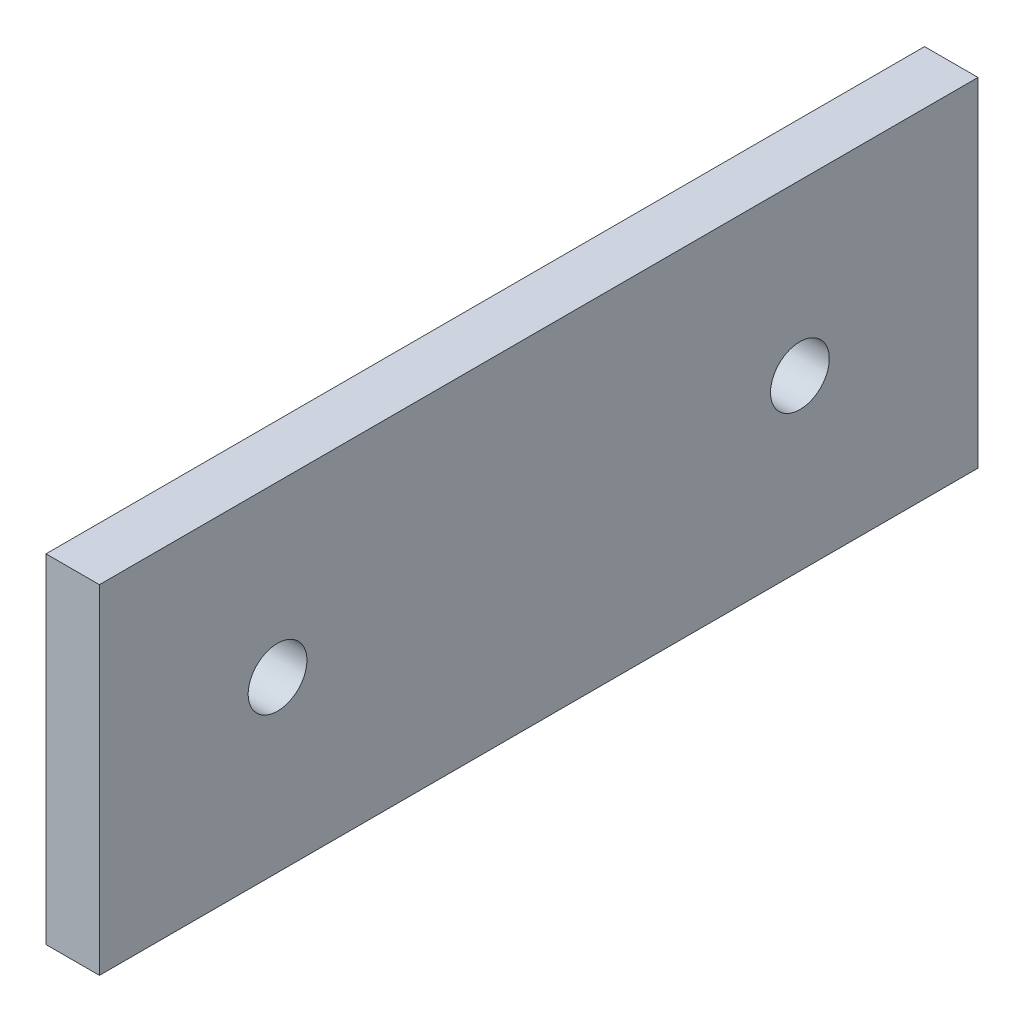
ISO-10303-21;
HEADER;
FILE_DESCRIPTION(('STEP AP214'),'2;1');
FILE_NAME('part.step','',(''),(''),'','','');
FILE_SCHEMA(('AUTOMOTIVE_DESIGN { 1 0 10303 214 1 1 1 1 }'));
ENDSEC;
DATA;
#1=APPLICATION_CONTEXT('core data for automotive mechanical design processes');
#2=APPLICATION_PROTOCOL_DEFINITION('international standard','automotive_design',2000,#1);
#3=PRODUCT_CONTEXT('',#1,'mechanical');
#4=PRODUCT('Part','Part','',(#3));
#5=PRODUCT_RELATED_PRODUCT_CATEGORY('part','',(#4));
#6=PRODUCT_DEFINITION_FORMATION('','',#4);
#7=PRODUCT_DEFINITION_CONTEXT('part definition',#1,'design');
#8=PRODUCT_DEFINITION('design','',#6,#7);
#9=PRODUCT_DEFINITION_SHAPE('','',#8);
#10=(LENGTH_UNIT() NAMED_UNIT(*) SI_UNIT(.MILLI.,.METRE.));
#11=(NAMED_UNIT(*) PLANE_ANGLE_UNIT() SI_UNIT($,.RADIAN.));
#12=(NAMED_UNIT(*) SI_UNIT($,.STERADIAN.) SOLID_ANGLE_UNIT());
#13=UNCERTAINTY_MEASURE_WITH_UNIT(LENGTH_MEASURE(1.E-05),#10,'distance_accuracy_value','');
#14=(GEOMETRIC_REPRESENTATION_CONTEXT(3) GLOBAL_UNCERTAINTY_ASSIGNED_CONTEXT((#13)) GLOBAL_UNIT_ASSIGNED_CONTEXT((#10,
#11,#12)) REPRESENTATION_CONTEXT('',''));
#15=CARTESIAN_POINT('',(0.,0.,0.));
#16=DIRECTION('',(0.,0.,1.));
#17=DIRECTION('',(1.,0.,0.));
#18=AXIS2_PLACEMENT_3D('',#15,#16,#17);
#19=CARTESIAN_POINT('',(0.,0.,49.33));
#20=DIRECTION('',(0.,0.,1.));
#21=DIRECTION('',(1.,0.,0.));
#22=AXIS2_PLACEMENT_3D('',#19,#20,#21);
#23=PLANE('',#22);
#24=DIRECTION('',(1.,0.,0.));
#25=VECTOR('',#24,1.);
#26=CARTESIAN_POINT('',(0.,-3.,49.33));
#27=LINE('',#26,#25);
#28=CARTESIAN_POINT('',(-3.,-3.,49.33));
#29=VERTEX_POINT('',#28);
#30=CARTESIAN_POINT('',(0.,-3.,49.33));
#31=VERTEX_POINT('',#30);
#32=EDGE_CURVE('E114',#29,#31,#27,.T.);
#33=ORIENTED_EDGE('',*,*,#32,.T.);
#34=DIRECTION('',(0.,-1.,0.));
#35=VECTOR('',#34,1.);
#36=CARTESIAN_POINT('',(0.,0.,49.33));
#37=LINE('',#36,#35);
#38=CARTESIAN_POINT('',(0.,16.,49.33));
#39=VERTEX_POINT('',#38);
#40=EDGE_CURVE('E94',#39,#31,#37,.T.);
#41=ORIENTED_EDGE('',*,*,#40,.F.);
#42=DIRECTION('',(-1.,0.,0.));
#43=VECTOR('',#42,1.);
#44=CARTESIAN_POINT('',(0.,16.,49.33));
#45=LINE('',#44,#43);
#46=CARTESIAN_POINT('',(-3.,16.,49.33));
#47=VERTEX_POINT('',#46);
#48=EDGE_CURVE('E77',#39,#47,#45,.T.);
#49=ORIENTED_EDGE('',*,*,#48,.T.);
#50=DIRECTION('',(0.,-1.,0.));
#51=VECTOR('',#50,1.);
#52=CARTESIAN_POINT('',(-3.,0.,49.33));
#53=LINE('',#52,#51);
#54=EDGE_CURVE('E117',#47,#29,#53,.T.);
#55=ORIENTED_EDGE('',*,*,#54,.T.);
#56=EDGE_LOOP('',(#33,#41,#49,#55));
#57=FACE_BOUND('',#56,.T.);
#58=ADVANCED_FACE('F60',(#57),#23,.T.);
#59=CARTESIAN_POINT('',(0.,0.,0.));
#60=DIRECTION('',(0.,0.,1.));
#61=DIRECTION('',(1.,0.,0.));
#62=AXIS2_PLACEMENT_3D('',#59,#60,#61);
#63=PLANE('',#62);
#64=DIRECTION('',(0.,-1.,0.));
#65=VECTOR('',#64,1.);
#66=CARTESIAN_POINT('',(0.,0.,0.));
#67=LINE('',#66,#65);
#68=CARTESIAN_POINT('',(0.,16.,0.));
#69=VERTEX_POINT('',#68);
#70=CARTESIAN_POINT('',(0.,-3.,0.));
#71=VERTEX_POINT('',#70);
#72=EDGE_CURVE('E110',#69,#71,#67,.T.);
#73=ORIENTED_EDGE('',*,*,#72,.T.);
#74=DIRECTION('',(1.,0.,0.));
#75=VECTOR('',#74,1.);
#76=CARTESIAN_POINT('',(0.,-3.,0.));
#77=LINE('',#76,#75);
#78=CARTESIAN_POINT('',(-3.,-3.,0.));
#79=VERTEX_POINT('',#78);
#80=EDGE_CURVE('E89',#79,#71,#77,.T.);
#81=ORIENTED_EDGE('',*,*,#80,.F.);
#82=DIRECTION('',(0.,-1.,0.));
#83=VECTOR('',#82,1.);
#84=CARTESIAN_POINT('',(-3.,0.,0.));
#85=LINE('',#84,#83);
#86=CARTESIAN_POINT('',(-3.,16.,0.));
#87=VERTEX_POINT('',#86);
#88=EDGE_CURVE('E109',#87,#79,#85,.T.);
#89=ORIENTED_EDGE('',*,*,#88,.F.);
#90=DIRECTION('',(-1.,0.,0.));
#91=VECTOR('',#90,1.);
#92=CARTESIAN_POINT('',(0.,16.,0.));
#93=LINE('',#92,#91);
#94=EDGE_CURVE('E121',#69,#87,#93,.T.);
#95=ORIENTED_EDGE('',*,*,#94,.F.);
#96=EDGE_LOOP('',(#73,#81,#89,#95));
#97=FACE_BOUND('',#96,.T.);
#98=ADVANCED_FACE('F132',(#97),#63,.F.);
#99=CARTESIAN_POINT('',(0.,-3.,49.33));
#100=DIRECTION('',(0.,1.,0.));
#101=DIRECTION('',(0.,0.,1.));
#102=AXIS2_PLACEMENT_3D('',#99,#100,#101);
#103=PLANE('',#102);
#104=DIRECTION('',(0.,0.,-1.));
#105=VECTOR('',#104,1.);
#106=CARTESIAN_POINT('',(0.,-3.,49.33));
#107=LINE('',#106,#105);
#108=EDGE_CURVE('E106',#31,#71,#107,.T.);
#109=ORIENTED_EDGE('',*,*,#108,.F.);
#110=ORIENTED_EDGE('',*,*,#32,.F.);
#111=DIRECTION('',(0.,0.,-1.));
#112=VECTOR('',#111,1.);
#113=CARTESIAN_POINT('',(-3.,-3.,49.33));
#114=LINE('',#113,#112);
#115=EDGE_CURVE('E12',#29,#79,#114,.T.);
#116=ORIENTED_EDGE('',*,*,#115,.T.);
#117=ORIENTED_EDGE('',*,*,#80,.T.);
#118=EDGE_LOOP('',(#109,#110,#116,#117));
#119=FACE_BOUND('',#118,.T.);
#120=ADVANCED_FACE('F113',(#119),#103,.F.);
#121=CARTESIAN_POINT('',(0.,16.,49.33));
#122=DIRECTION('',(0.,-1.,0.));
#123=DIRECTION('',(0.,0.,-1.));
#124=AXIS2_PLACEMENT_3D('',#121,#122,#123);
#125=PLANE('',#124);
#126=DIRECTION('',(0.,0.,1.));
#127=VECTOR('',#126,1.);
#128=CARTESIAN_POINT('',(0.,16.,49.33));
#129=LINE('',#128,#127);
#130=EDGE_CURVE('E108',#69,#39,#129,.T.);
#131=ORIENTED_EDGE('',*,*,#130,.F.);
#132=ORIENTED_EDGE('',*,*,#94,.T.);
#133=DIRECTION('',(0.,0.,-1.));
#134=VECTOR('',#133,1.);
#135=CARTESIAN_POINT('',(-3.,16.,49.33));
#136=LINE('',#135,#134);
#137=EDGE_CURVE('E69',#47,#87,#136,.T.);
#138=ORIENTED_EDGE('',*,*,#137,.F.);
#139=ORIENTED_EDGE('',*,*,#48,.F.);
#140=EDGE_LOOP('',(#131,#132,#138,#139));
#141=FACE_BOUND('',#140,.T.);
#142=ADVANCED_FACE('F133',(#141),#125,.F.);
#143=CARTESIAN_POINT('',(-3.,0.,49.33));
#144=DIRECTION('',(1.,0.,0.));
#145=DIRECTION('',(0.,0.,-1.));
#146=AXIS2_PLACEMENT_3D('',#143,#144,#145);
#147=PLANE('',#146);
#148=CARTESIAN_POINT('',(-3.,6.5,10.));
#149=DIRECTION('',(-1.,0.,0.));
#150=DIRECTION('',(0.,0.,1.));
#151=AXIS2_PLACEMENT_3D('',#148,#149,#150);
#152=CIRCLE('',#151,1.65);
#153=CARTESIAN_POINT('',(-3.,6.5,11.65));
#154=VERTEX_POINT('',#153);
#155=EDGE_CURVE('E137',#154,#154,#152,.T.);
#156=ORIENTED_EDGE('',*,*,#155,.F.);
#157=EDGE_LOOP('',(#156));
#158=FACE_BOUND('',#157,.T.);
#159=CARTESIAN_POINT('',(-3.,6.5,39.33));
#160=DIRECTION('',(-1.,0.,0.));
#161=DIRECTION('',(0.,0.,1.));
#162=AXIS2_PLACEMENT_3D('',#159,#160,#161);
#163=CIRCLE('',#162,1.65);
#164=CARTESIAN_POINT('',(-3.,6.5,40.98));
#165=VERTEX_POINT('',#164);
#166=EDGE_CURVE('E134',#165,#165,#163,.T.);
#167=ORIENTED_EDGE('',*,*,#166,.F.);
#168=EDGE_LOOP('',(#167));
#169=FACE_BOUND('',#168,.T.);
#170=ORIENTED_EDGE('',*,*,#88,.T.);
#171=ORIENTED_EDGE('',*,*,#115,.F.);
#172=ORIENTED_EDGE('',*,*,#54,.F.);
#173=ORIENTED_EDGE('',*,*,#137,.T.);
#174=EDGE_LOOP('',(#170,#171,#172,#173));
#175=FACE_BOUND('',#174,.T.);
#176=ADVANCED_FACE('F62',(#158,#169,#175),#147,.F.);
#177=CARTESIAN_POINT('',(0.,0.,49.33));
#178=DIRECTION('',(1.,0.,0.));
#179=DIRECTION('',(0.,0.,-1.));
#180=AXIS2_PLACEMENT_3D('',#177,#178,#179);
#181=PLANE('',#180);
#182=CARTESIAN_POINT('',(0.,6.5,10.));
#183=DIRECTION('',(1.,0.,0.));
#184=DIRECTION('',(0.,0.,-1.));
#185=AXIS2_PLACEMENT_3D('',#182,#183,#184);
#186=CIRCLE('',#185,1.65);
#187=CARTESIAN_POINT('',(0.,6.5,11.65));
#188=VERTEX_POINT('',#187);
#189=EDGE_CURVE('E145',#188,#188,#186,.T.);
#190=ORIENTED_EDGE('',*,*,#189,.F.);
#191=EDGE_LOOP('',(#190));
#192=FACE_BOUND('',#191,.T.);
#193=CARTESIAN_POINT('',(0.,6.5,39.33));
#194=DIRECTION('',(1.,0.,0.));
#195=DIRECTION('',(0.,0.,-1.));
#196=AXIS2_PLACEMENT_3D('',#193,#194,#195);
#197=CIRCLE('',#196,1.65);
#198=CARTESIAN_POINT('',(0.,6.5,40.98));
#199=VERTEX_POINT('',#198);
#200=EDGE_CURVE('E141',#199,#199,#197,.T.);
#201=ORIENTED_EDGE('',*,*,#200,.F.);
#202=EDGE_LOOP('',(#201));
#203=FACE_BOUND('',#202,.T.);
#204=ORIENTED_EDGE('',*,*,#72,.F.);
#205=ORIENTED_EDGE('',*,*,#130,.T.);
#206=ORIENTED_EDGE('',*,*,#40,.T.);
#207=ORIENTED_EDGE('',*,*,#108,.T.);
#208=EDGE_LOOP('',(#204,#205,#206,#207));
#209=FACE_BOUND('',#208,.T.);
#210=ADVANCED_FACE('F105',(#192,#203,#209),#181,.T.);
#211=CARTESIAN_POINT('',(27.,6.5,39.33));
#212=DIRECTION('',(-1.,0.,0.));
#213=DIRECTION('',(0.,0.,1.));
#214=AXIS2_PLACEMENT_3D('',#211,#212,#213);
#215=CYLINDRICAL_SURFACE('',#214,1.65);
#216=CARTESIAN_POINT('',(0.,6.5,40.98));
#217=CARTESIAN_POINT('',(-0.0312500000000035,6.5,40.98));
#218=CARTESIAN_POINT('',(-0.0625000000000035,6.5,40.98));
#219=CARTESIAN_POINT('',(-0.125000000000004,6.5,40.98));
#220=CARTESIAN_POINT('',(-0.156250000000004,6.5,40.98));
#221=CARTESIAN_POINT('',(-0.218750000000004,6.5,40.98));
#222=CARTESIAN_POINT('',(-0.250000000000004,6.5,40.98));
#223=CARTESIAN_POINT('',(-0.312500000000004,6.5,40.98));
#224=CARTESIAN_POINT('',(-0.343750000000004,6.5,40.98));
#225=CARTESIAN_POINT('',(-0.406250000000004,6.5,40.98));
#226=CARTESIAN_POINT('',(-0.437500000000004,6.5,40.98));
#227=CARTESIAN_POINT('',(-0.500000000000004,6.5,40.98));
#228=CARTESIAN_POINT('',(-0.531250000000004,6.5,40.98));
#229=CARTESIAN_POINT('',(-0.593750000000004,6.5,40.98));
#230=CARTESIAN_POINT('',(-0.625000000000004,6.5,40.98));
#231=CARTESIAN_POINT('',(-0.687500000000004,6.5,40.98));
#232=CARTESIAN_POINT('',(-0.718750000000004,6.5,40.98));
#233=CARTESIAN_POINT('',(-0.781250000000003,6.5,40.98));
#234=CARTESIAN_POINT('',(-0.812500000000002,6.5,40.98));
#235=CARTESIAN_POINT('',(-0.875000000000001,6.5,40.98));
#236=CARTESIAN_POINT('',(-0.906250000000001,6.5,40.98));
#237=CARTESIAN_POINT('',(-0.968750000000001,6.5,40.98));
#238=CARTESIAN_POINT('',(-1.,6.5,40.98));
#239=CARTESIAN_POINT('',(-1.0625,6.5,40.98));
#240=CARTESIAN_POINT('',(-1.09375,6.5,40.98));
#241=CARTESIAN_POINT('',(-1.15625,6.5,40.98));
#242=CARTESIAN_POINT('',(-1.1875,6.5,40.98));
#243=CARTESIAN_POINT('',(-1.25,6.5,40.98));
#244=CARTESIAN_POINT('',(-1.28125,6.5,40.98));
#245=CARTESIAN_POINT('',(-1.34375,6.5,40.98));
#246=CARTESIAN_POINT('',(-1.375,6.5,40.98));
#247=CARTESIAN_POINT('',(-1.4375,6.5,40.98));
#248=CARTESIAN_POINT('',(-1.46875,6.5,40.98));
#249=CARTESIAN_POINT('',(-1.53125,6.5,40.98));
#250=CARTESIAN_POINT('',(-1.5625,6.5,40.98));
#251=CARTESIAN_POINT('',(-1.625,6.5,40.98));
#252=CARTESIAN_POINT('',(-1.65625,6.5,40.98));
#253=CARTESIAN_POINT('',(-1.71875,6.5,40.98));
#254=CARTESIAN_POINT('',(-1.75,6.5,40.98));
#255=CARTESIAN_POINT('',(-1.8125,6.5,40.98));
#256=CARTESIAN_POINT('',(-1.84375,6.5,40.98));
#257=CARTESIAN_POINT('',(-1.90625,6.5,40.98));
#258=CARTESIAN_POINT('',(-1.9375,6.5,40.98));
#259=CARTESIAN_POINT('',(-2.,6.5,40.98));
#260=CARTESIAN_POINT('',(-2.03125,6.5,40.98));
#261=CARTESIAN_POINT('',(-2.09375,6.5,40.98));
#262=CARTESIAN_POINT('',(-2.125,6.5,40.98));
#263=CARTESIAN_POINT('',(-2.1875,6.5,40.98));
#264=CARTESIAN_POINT('',(-2.21875,6.5,40.98));
#265=CARTESIAN_POINT('',(-2.28125,6.5,40.98));
#266=CARTESIAN_POINT('',(-2.3125,6.5,40.98));
#267=CARTESIAN_POINT('',(-2.375,6.5,40.98));
#268=CARTESIAN_POINT('',(-2.40625,6.5,40.98));
#269=CARTESIAN_POINT('',(-2.46875,6.5,40.98));
#270=CARTESIAN_POINT('',(-2.5,6.5,40.98));
#271=CARTESIAN_POINT('',(-2.5625,6.5,40.98));
#272=CARTESIAN_POINT('',(-2.59375,6.5,40.98));
#273=CARTESIAN_POINT('',(-2.65625,6.5,40.98));
#274=CARTESIAN_POINT('',(-2.6875,6.5,40.98));
#275=CARTESIAN_POINT('',(-2.75,6.5,40.98));
#276=CARTESIAN_POINT('',(-2.78125,6.5,40.98));
#277=CARTESIAN_POINT('',(-2.84375,6.5,40.98));
#278=CARTESIAN_POINT('',(-2.875,6.5,40.98));
#279=CARTESIAN_POINT('',(-2.9375,6.5,40.98));
#280=CARTESIAN_POINT('',(-2.96875,6.5,40.98));
#281=CARTESIAN_POINT('',(-3.,6.5,40.98));
#282=B_SPLINE_CURVE_WITH_KNOTS('',3,(#216,#217,#218,#219,#220,#221,#222,#223,#224,#225,#226,
#227,#228,#229,#230,#231,#232,#233,#234,#235,#236,#237,#238,#239,#240,#241,#242,#243,#244,#245,
#246,#247,#248,#249,#250,#251,#252,#253,#254,#255,#256,#257,#258,#259,#260,#261,#262,#263,#264,
#265,#266,#267,#268,#269,#270,#271,#272,#273,#274,#275,#276,#277,#278,#279,#280,#281),
.UNSPECIFIED.,.F.,.F.,(4,2,2,2,2,2,2,2,2,2,2,2,2,2,2,2,2,2,2,2,2,2,2,2,2,2,2,2,2,2,2,2,4),(0.,
0.0937500000000001,0.1875,0.28125,0.375,0.46875,0.5625,0.656250000000001,0.750000000000001,
0.843749999999997,0.937499999999997,1.03125,1.125,1.21875,1.3125,1.40625,1.5,1.59375,1.6875,
1.78125,1.875,1.96875,2.0625,2.15625,2.25,2.34375,2.4375,2.53125,2.625,2.71875,2.8125,2.90625,
3.),.UNSPECIFIED.);
#283=EDGE_CURVE('BSEAM154',#199,#165,#282,.T.);
#284=ORIENTED_EDGE('',*,*,#200,.T.);
#285=ORIENTED_EDGE('',*,*,#166,.T.);
#286=ORIENTED_EDGE('',*,*,#283,.T.);
#287=ORIENTED_EDGE('',*,*,#283,.F.);
#288=EDGE_LOOP('',(#284,#286,#285,#287));
#289=FACE_BOUND('',#288,.T.);
#290=ADVANCED_FACE('F154',(#289),#215,.F.);
#291=CARTESIAN_POINT('',(27.,6.5,10.));
#292=DIRECTION('',(-1.,0.,0.));
#293=DIRECTION('',(0.,0.,1.));
#294=AXIS2_PLACEMENT_3D('',#291,#292,#293);
#295=CYLINDRICAL_SURFACE('',#294,1.65);
#296=CARTESIAN_POINT('',(0.,6.5,11.65));
#297=CARTESIAN_POINT('',(-0.0312500000000035,6.5,11.65));
#298=CARTESIAN_POINT('',(-0.0625000000000035,6.5,11.65));
#299=CARTESIAN_POINT('',(-0.125000000000004,6.5,11.65));
#300=CARTESIAN_POINT('',(-0.156250000000004,6.5,11.65));
#301=CARTESIAN_POINT('',(-0.218750000000004,6.5,11.65));
#302=CARTESIAN_POINT('',(-0.250000000000004,6.5,11.65));
#303=CARTESIAN_POINT('',(-0.312500000000004,6.5,11.65));
#304=CARTESIAN_POINT('',(-0.343750000000004,6.5,11.65));
#305=CARTESIAN_POINT('',(-0.406250000000004,6.5,11.65));
#306=CARTESIAN_POINT('',(-0.437500000000004,6.5,11.65));
#307=CARTESIAN_POINT('',(-0.500000000000004,6.5,11.65));
#308=CARTESIAN_POINT('',(-0.531250000000004,6.5,11.65));
#309=CARTESIAN_POINT('',(-0.593750000000004,6.5,11.65));
#310=CARTESIAN_POINT('',(-0.625000000000004,6.5,11.65));
#311=CARTESIAN_POINT('',(-0.687500000000004,6.5,11.65));
#312=CARTESIAN_POINT('',(-0.718750000000004,6.5,11.65));
#313=CARTESIAN_POINT('',(-0.781250000000003,6.5,11.65));
#314=CARTESIAN_POINT('',(-0.812500000000002,6.5,11.65));
#315=CARTESIAN_POINT('',(-0.875000000000001,6.5,11.65));
#316=CARTESIAN_POINT('',(-0.906250000000001,6.5,11.65));
#317=CARTESIAN_POINT('',(-0.968750000000001,6.5,11.65));
#318=CARTESIAN_POINT('',(-1.,6.5,11.65));
#319=CARTESIAN_POINT('',(-1.0625,6.5,11.65));
#320=CARTESIAN_POINT('',(-1.09375,6.5,11.65));
#321=CARTESIAN_POINT('',(-1.15625,6.5,11.65));
#322=CARTESIAN_POINT('',(-1.1875,6.5,11.65));
#323=CARTESIAN_POINT('',(-1.25,6.5,11.65));
#324=CARTESIAN_POINT('',(-1.28125,6.5,11.65));
#325=CARTESIAN_POINT('',(-1.34375,6.5,11.65));
#326=CARTESIAN_POINT('',(-1.375,6.5,11.65));
#327=CARTESIAN_POINT('',(-1.4375,6.5,11.65));
#328=CARTESIAN_POINT('',(-1.46875,6.5,11.65));
#329=CARTESIAN_POINT('',(-1.53125,6.5,11.65));
#330=CARTESIAN_POINT('',(-1.5625,6.5,11.65));
#331=CARTESIAN_POINT('',(-1.625,6.5,11.65));
#332=CARTESIAN_POINT('',(-1.65625,6.5,11.65));
#333=CARTESIAN_POINT('',(-1.71875,6.5,11.65));
#334=CARTESIAN_POINT('',(-1.75,6.5,11.65));
#335=CARTESIAN_POINT('',(-1.8125,6.5,11.65));
#336=CARTESIAN_POINT('',(-1.84375,6.5,11.65));
#337=CARTESIAN_POINT('',(-1.90625,6.5,11.65));
#338=CARTESIAN_POINT('',(-1.9375,6.5,11.65));
#339=CARTESIAN_POINT('',(-2.,6.5,11.65));
#340=CARTESIAN_POINT('',(-2.03125,6.5,11.65));
#341=CARTESIAN_POINT('',(-2.09375,6.5,11.65));
#342=CARTESIAN_POINT('',(-2.125,6.5,11.65));
#343=CARTESIAN_POINT('',(-2.1875,6.5,11.65));
#344=CARTESIAN_POINT('',(-2.21875,6.5,11.65));
#345=CARTESIAN_POINT('',(-2.28125,6.5,11.65));
#346=CARTESIAN_POINT('',(-2.3125,6.5,11.65));
#347=CARTESIAN_POINT('',(-2.375,6.5,11.65));
#348=CARTESIAN_POINT('',(-2.40625,6.5,11.65));
#349=CARTESIAN_POINT('',(-2.46875,6.5,11.65));
#350=CARTESIAN_POINT('',(-2.5,6.5,11.65));
#351=CARTESIAN_POINT('',(-2.5625,6.5,11.65));
#352=CARTESIAN_POINT('',(-2.59375,6.5,11.65));
#353=CARTESIAN_POINT('',(-2.65625,6.5,11.65));
#354=CARTESIAN_POINT('',(-2.6875,6.5,11.65));
#355=CARTESIAN_POINT('',(-2.75,6.5,11.65));
#356=CARTESIAN_POINT('',(-2.78125,6.5,11.65));
#357=CARTESIAN_POINT('',(-2.84375,6.5,11.65));
#358=CARTESIAN_POINT('',(-2.875,6.5,11.65));
#359=CARTESIAN_POINT('',(-2.9375,6.5,11.65));
#360=CARTESIAN_POINT('',(-2.96875,6.5,11.65));
#361=CARTESIAN_POINT('',(-3.,6.5,11.65));
#362=B_SPLINE_CURVE_WITH_KNOTS('',3,(#296,#297,#298,#299,#300,#301,#302,#303,#304,#305,#306,
#307,#308,#309,#310,#311,#312,#313,#314,#315,#316,#317,#318,#319,#320,#321,#322,#323,#324,#325,
#326,#327,#328,#329,#330,#331,#332,#333,#334,#335,#336,#337,#338,#339,#340,#341,#342,#343,#344,
#345,#346,#347,#348,#349,#350,#351,#352,#353,#354,#355,#356,#357,#358,#359,#360,#361),
.UNSPECIFIED.,.F.,.F.,(4,2,2,2,2,2,2,2,2,2,2,2,2,2,2,2,2,2,2,2,2,2,2,2,2,2,2,2,2,2,2,2,4),(0.,
0.0937500000000001,0.1875,0.28125,0.375,0.46875,0.5625,0.656250000000001,0.750000000000001,
0.843749999999997,0.937499999999997,1.03125,1.125,1.21875,1.3125,1.40625,1.5,1.59375,1.6875,
1.78125,1.875,1.96875,2.0625,2.15625,2.25,2.34375,2.4375,2.53125,2.625,2.71875,2.8125,2.90625,
3.),.UNSPECIFIED.);
#363=EDGE_CURVE('BSEAM149',#188,#154,#362,.T.);
#364=ORIENTED_EDGE('',*,*,#189,.T.);
#365=ORIENTED_EDGE('',*,*,#155,.T.);
#366=ORIENTED_EDGE('',*,*,#363,.T.);
#367=ORIENTED_EDGE('',*,*,#363,.F.);
#368=EDGE_LOOP('',(#364,#366,#365,#367));
#369=FACE_BOUND('',#368,.T.);
#370=ADVANCED_FACE('F149',(#369),#295,.F.);
#371=CLOSED_SHELL('',(#58,#98,#120,#142,#176,#210,#290,#370));
#372=MANIFOLD_SOLID_BREP('B2',#371);
#373=ADVANCED_BREP_SHAPE_REPRESENTATION('',(#18,#372),#14);
#374=SHAPE_DEFINITION_REPRESENTATION(#9,#373);
ENDSEC;
END-ISO-10303-21;
